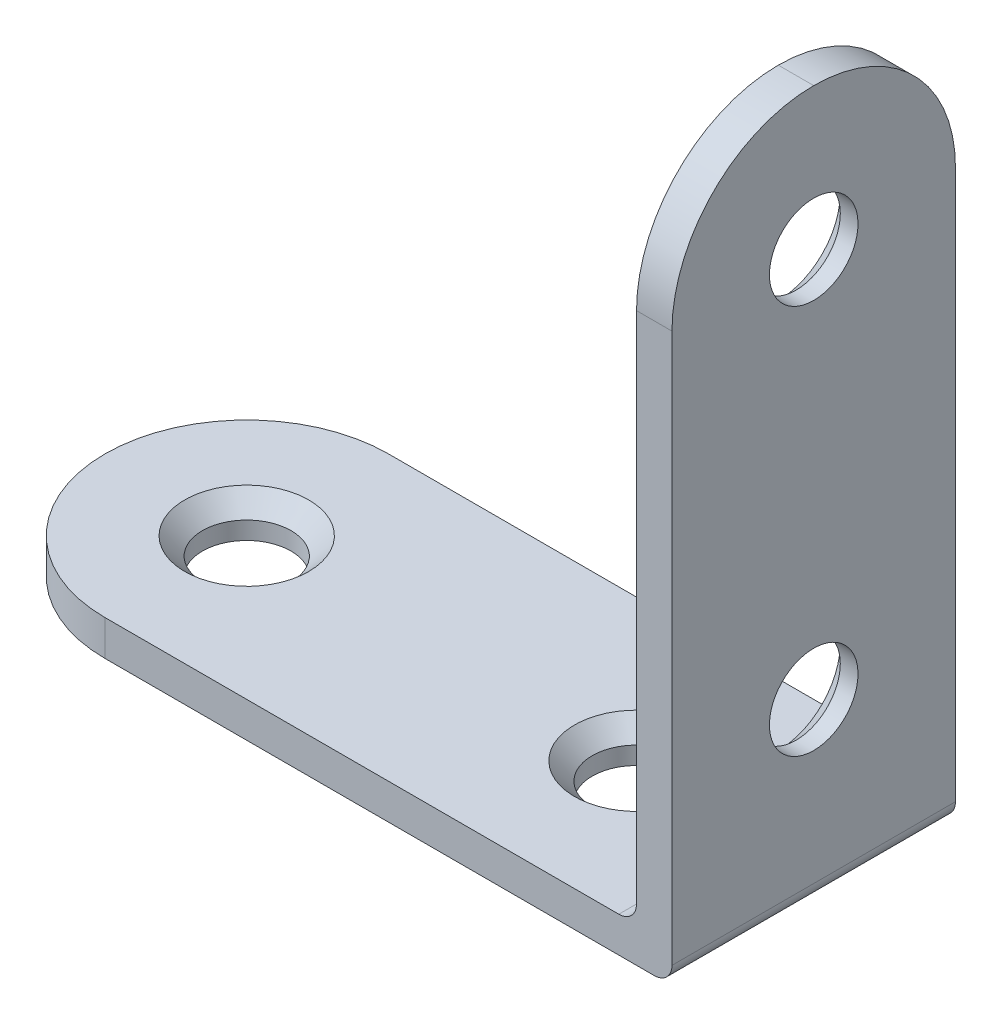
ISO-10303-21;
HEADER;
FILE_DESCRIPTION(('STEP AP214'),'2;1');
FILE_NAME('part.step','',(''),(''),'','','');
FILE_SCHEMA(('AUTOMOTIVE_DESIGN { 1 0 10303 214 1 1 1 1 }'));
ENDSEC;
DATA;
#1=APPLICATION_CONTEXT('core data for automotive mechanical design processes');
#2=APPLICATION_PROTOCOL_DEFINITION('international standard','automotive_design',2000,#1);
#3=PRODUCT_CONTEXT('',#1,'mechanical');
#4=PRODUCT('Part','Part','',(#3));
#5=PRODUCT_RELATED_PRODUCT_CATEGORY('part','',(#4));
#6=PRODUCT_DEFINITION_FORMATION('','',#4);
#7=PRODUCT_DEFINITION_CONTEXT('part definition',#1,'design');
#8=PRODUCT_DEFINITION('design','',#6,#7);
#9=PRODUCT_DEFINITION_SHAPE('','',#8);
#10=(LENGTH_UNIT() NAMED_UNIT(*) SI_UNIT(.MILLI.,.METRE.));
#11=(NAMED_UNIT(*) PLANE_ANGLE_UNIT() SI_UNIT($,.RADIAN.));
#12=(NAMED_UNIT(*) SI_UNIT($,.STERADIAN.) SOLID_ANGLE_UNIT());
#13=UNCERTAINTY_MEASURE_WITH_UNIT(LENGTH_MEASURE(1.E-05),#10,'distance_accuracy_value','');
#14=(GEOMETRIC_REPRESENTATION_CONTEXT(3) GLOBAL_UNCERTAINTY_ASSIGNED_CONTEXT((#13)) GLOBAL_UNIT_ASSIGNED_CONTEXT((#10,
#11,#12)) REPRESENTATION_CONTEXT('',''));
#15=CARTESIAN_POINT('',(0.,0.,0.));
#16=DIRECTION('',(0.,0.,1.));
#17=DIRECTION('',(1.,0.,0.));
#18=AXIS2_PLACEMENT_3D('',#15,#16,#17);
#19=CARTESIAN_POINT('',(0.,38.,16.));
#20=DIRECTION('',(1.,0.,0.));
#21=DIRECTION('',(0.,1.,0.));
#22=AXIS2_PLACEMENT_3D('',#19,#20,#21);
#23=PLANE('',#22);
#24=CARTESIAN_POINT('',(0.,8.00000000000003,8.));
#25=DIRECTION('',(1.,0.,0.));
#26=DIRECTION('',(0.,1.,0.));
#27=AXIS2_PLACEMENT_3D('',#24,#25,#26);
#28=CIRCLE('',#27,3.5);
#29=CARTESIAN_POINT('',(0.,11.5,8.));
#30=VERTEX_POINT('',#29);
#31=EDGE_CURVE('E210',#30,#30,#28,.T.);
#32=ORIENTED_EDGE('',*,*,#31,.T.);
#33=EDGE_LOOP('',(#32));
#34=FACE_BOUND('',#33,.T.);
#35=CARTESIAN_POINT('',(0.,30.,8.));
#36=DIRECTION('',(1.,0.,0.));
#37=DIRECTION('',(0.,1.,0.));
#38=AXIS2_PLACEMENT_3D('',#35,#36,#37);
#39=CIRCLE('',#38,3.5);
#40=CARTESIAN_POINT('',(0.,33.5,8.));
#41=VERTEX_POINT('',#40);
#42=EDGE_CURVE('E206',#41,#41,#39,.T.);
#43=ORIENTED_EDGE('',*,*,#42,.T.);
#44=EDGE_LOOP('',(#43));
#45=FACE_BOUND('',#44,.T.);
#46=DIRECTION('',(0.,-1.,0.));
#47=VECTOR('',#46,1.);
#48=CARTESIAN_POINT('',(0.,38.,0.));
#49=LINE('',#48,#47);
#50=CARTESIAN_POINT('',(0.,30.,0.));
#51=VERTEX_POINT('',#50);
#52=CARTESIAN_POINT('',(0.,1.,0.));
#53=VERTEX_POINT('',#52);
#54=EDGE_CURVE('E182',#51,#53,#49,.T.);
#55=ORIENTED_EDGE('',*,*,#54,.T.);
#56=DIRECTION('',(0.,0.,-1.));
#57=VECTOR('',#56,1.);
#58=CARTESIAN_POINT('',(0.,1.,16.));
#59=LINE('',#58,#57);
#60=CARTESIAN_POINT('',(0.,1.,16.));
#61=VERTEX_POINT('',#60);
#62=EDGE_CURVE('E55',#53,#61,#59,.F.);
#63=ORIENTED_EDGE('',*,*,#62,.T.);
#64=DIRECTION('',(0.,-1.,0.));
#65=VECTOR('',#64,1.);
#66=CARTESIAN_POINT('',(0.,38.,16.));
#67=LINE('',#66,#65);
#68=CARTESIAN_POINT('',(0.,30.,16.));
#69=VERTEX_POINT('',#68);
#70=EDGE_CURVE('E266',#69,#61,#67,.T.);
#71=ORIENTED_EDGE('',*,*,#70,.F.);
#72=CARTESIAN_POINT('',(0.,30.,8.));
#73=DIRECTION('',(1.,0.,0.));
#74=DIRECTION('',(0.,1.,0.));
#75=AXIS2_PLACEMENT_3D('',#72,#73,#74);
#76=CIRCLE('',#75,8.);
#77=CARTESIAN_POINT('',(0.,38.,8.));
#78=VERTEX_POINT('',#77);
#79=EDGE_CURVE('E168',#69,#78,#76,.F.);
#80=ORIENTED_EDGE('',*,*,#79,.T.);
#81=CARTESIAN_POINT('',(0.,30.,8.));
#82=DIRECTION('',(1.,0.,0.));
#83=DIRECTION('',(0.,1.,0.));
#84=AXIS2_PLACEMENT_3D('',#81,#82,#83);
#85=CIRCLE('',#84,8.);
#86=EDGE_CURVE('E165',#78,#51,#85,.F.);
#87=ORIENTED_EDGE('',*,*,#86,.T.);
#88=EDGE_LOOP('',(#55,#63,#71,#80,#87));
#89=FACE_BOUND('',#88,.T.);
#90=ADVANCED_FACE('F39',(#34,#45,#89),#23,.F.);
#91=CARTESIAN_POINT('',(0.,0.,16.));
#92=DIRECTION('',(0.,-1.,0.));
#93=DIRECTION('',(1.,0.,0.));
#94=AXIS2_PLACEMENT_3D('',#91,#92,#93);
#95=PLANE('',#94);
#96=CARTESIAN_POINT('',(-8.00000000000001,0.,8.));
#97=DIRECTION('',(0.,-1.,0.));
#98=DIRECTION('',(1.,0.,0.));
#99=AXIS2_PLACEMENT_3D('',#96,#97,#98);
#100=CIRCLE('',#99,3.50000000000001);
#101=CARTESIAN_POINT('',(-4.5,0.,8.));
#102=VERTEX_POINT('',#101);
#103=EDGE_CURVE('E222',#102,#102,#100,.T.);
#104=ORIENTED_EDGE('',*,*,#103,.T.);
#105=EDGE_LOOP('',(#104));
#106=FACE_BOUND('',#105,.T.);
#107=CARTESIAN_POINT('',(-30.,0.,8.));
#108=DIRECTION('',(0.,-1.,0.));
#109=DIRECTION('',(1.,0.,0.));
#110=AXIS2_PLACEMENT_3D('',#107,#108,#109);
#111=CIRCLE('',#110,3.50000000000003);
#112=CARTESIAN_POINT('',(-26.5,0.,8.));
#113=VERTEX_POINT('',#112);
#114=EDGE_CURVE('E218',#113,#113,#111,.T.);
#115=ORIENTED_EDGE('',*,*,#114,.T.);
#116=EDGE_LOOP('',(#115));
#117=FACE_BOUND('',#116,.T.);
#118=DIRECTION('',(-1.,0.,0.));
#119=VECTOR('',#118,1.);
#120=CARTESIAN_POINT('',(0.,0.,16.));
#121=LINE('',#120,#119);
#122=CARTESIAN_POINT('',(-1.,0.,16.));
#123=VERTEX_POINT('',#122);
#124=CARTESIAN_POINT('',(-30.,0.,16.));
#125=VERTEX_POINT('',#124);
#126=EDGE_CURVE('E261',#123,#125,#121,.T.);
#127=ORIENTED_EDGE('',*,*,#126,.F.);
#128=DIRECTION('',(0.,0.,-1.));
#129=VECTOR('',#128,1.);
#130=CARTESIAN_POINT('',(-1.,0.,0.));
#131=LINE('',#130,#129);
#132=CARTESIAN_POINT('',(-1.,0.,0.));
#133=VERTEX_POINT('',#132);
#134=EDGE_CURVE('E246',#123,#133,#131,.T.);
#135=ORIENTED_EDGE('',*,*,#134,.T.);
#136=DIRECTION('',(-1.,0.,0.));
#137=VECTOR('',#136,1.);
#138=CARTESIAN_POINT('',(0.,0.,0.));
#139=LINE('',#138,#137);
#140=CARTESIAN_POINT('',(-30.,0.,0.));
#141=VERTEX_POINT('',#140);
#142=EDGE_CURVE('E141',#133,#141,#139,.T.);
#143=ORIENTED_EDGE('',*,*,#142,.T.);
#144=CARTESIAN_POINT('',(-30.,0.,8.));
#145=DIRECTION('',(0.,-1.,0.));
#146=DIRECTION('',(1.,0.,0.));
#147=AXIS2_PLACEMENT_3D('',#144,#145,#146);
#148=CIRCLE('',#147,8.);
#149=CARTESIAN_POINT('',(-38.,0.,8.));
#150=VERTEX_POINT('',#149);
#151=EDGE_CURVE('E145',#141,#150,#148,.F.);
#152=ORIENTED_EDGE('',*,*,#151,.T.);
#153=CARTESIAN_POINT('',(-30.,0.,8.));
#154=DIRECTION('',(0.,-1.,0.));
#155=DIRECTION('',(1.,0.,0.));
#156=AXIS2_PLACEMENT_3D('',#153,#154,#155);
#157=CIRCLE('',#156,8.);
#158=EDGE_CURVE('E147',#150,#125,#157,.F.);
#159=ORIENTED_EDGE('',*,*,#158,.T.);
#160=EDGE_LOOP('',(#127,#135,#143,#152,#159));
#161=FACE_BOUND('',#160,.T.);
#162=ADVANCED_FACE('F260',(#106,#117,#161),#95,.F.);
#163=CARTESIAN_POINT('',(-38.,-2.,16.));
#164=DIRECTION('',(0.,1.,0.));
#165=DIRECTION('',(-1.,0.,0.));
#166=AXIS2_PLACEMENT_3D('',#163,#164,#165);
#167=PLANE('',#166);
#168=CARTESIAN_POINT('',(-30.,-1.99999999999999,8.));
#169=DIRECTION('',(0.,1.,0.));
#170=DIRECTION('',(-1.,0.,0.));
#171=AXIS2_PLACEMENT_3D('',#168,#169,#170);
#172=CIRCLE('',#171,2.5);
#173=CARTESIAN_POINT('',(-32.5,-1.99999999999999,8.));
#174=VERTEX_POINT('',#173);
#175=EDGE_CURVE('E192',#174,#174,#172,.T.);
#176=ORIENTED_EDGE('',*,*,#175,.T.);
#177=EDGE_LOOP('',(#176));
#178=FACE_BOUND('',#177,.T.);
#179=CARTESIAN_POINT('',(-8.00000000000001,-2.,8.));
#180=DIRECTION('',(0.,1.,0.));
#181=DIRECTION('',(-1.,0.,0.));
#182=AXIS2_PLACEMENT_3D('',#179,#180,#181);
#183=CIRCLE('',#182,2.5);
#184=CARTESIAN_POINT('',(-10.5,-2.,8.));
#185=VERTEX_POINT('',#184);
#186=EDGE_CURVE('E196',#185,#185,#183,.T.);
#187=ORIENTED_EDGE('',*,*,#186,.T.);
#188=EDGE_LOOP('',(#187));
#189=FACE_BOUND('',#188,.T.);
#190=DIRECTION('',(1.,0.,0.));
#191=VECTOR('',#190,1.);
#192=CARTESIAN_POINT('',(-38.,-2.,0.));
#193=LINE('',#192,#191);
#194=CARTESIAN_POINT('',(-30.,-2.,0.));
#195=VERTEX_POINT('',#194);
#196=CARTESIAN_POINT('',(1.,-2.,0.));
#197=VERTEX_POINT('',#196);
#198=EDGE_CURVE('E120',#195,#197,#193,.T.);
#199=ORIENTED_EDGE('',*,*,#198,.T.);
#200=DIRECTION('',(0.,0.,-1.));
#201=VECTOR('',#200,1.);
#202=CARTESIAN_POINT('',(1.,-2.,16.));
#203=LINE('',#202,#201);
#204=CARTESIAN_POINT('',(1.,-2.,16.));
#205=VERTEX_POINT('',#204);
#206=EDGE_CURVE('E240',#197,#205,#203,.F.);
#207=ORIENTED_EDGE('',*,*,#206,.T.);
#208=DIRECTION('',(1.,0.,0.));
#209=VECTOR('',#208,1.);
#210=CARTESIAN_POINT('',(-38.,-2.,16.));
#211=LINE('',#210,#209);
#212=CARTESIAN_POINT('',(-30.,-2.,16.));
#213=VERTEX_POINT('',#212);
#214=EDGE_CURVE('E265',#213,#205,#211,.T.);
#215=ORIENTED_EDGE('',*,*,#214,.F.);
#216=CARTESIAN_POINT('',(-30.,-2.,8.));
#217=DIRECTION('',(0.,1.,0.));
#218=DIRECTION('',(-1.,0.,0.));
#219=AXIS2_PLACEMENT_3D('',#216,#217,#218);
#220=CIRCLE('',#219,8.);
#221=CARTESIAN_POINT('',(-38.,-2.,8.));
#222=VERTEX_POINT('',#221);
#223=EDGE_CURVE('E124',#213,#222,#220,.F.);
#224=ORIENTED_EDGE('',*,*,#223,.T.);
#225=CARTESIAN_POINT('',(-30.,-2.,8.));
#226=DIRECTION('',(0.,1.,0.));
#227=DIRECTION('',(-1.,0.,0.));
#228=AXIS2_PLACEMENT_3D('',#225,#226,#227);
#229=CIRCLE('',#228,8.);
#230=EDGE_CURVE('E117',#222,#195,#229,.F.);
#231=ORIENTED_EDGE('',*,*,#230,.T.);
#232=EDGE_LOOP('',(#199,#207,#215,#224,#231));
#233=FACE_BOUND('',#232,.T.);
#234=ADVANCED_FACE('F119',(#178,#189,#233),#167,.F.);
#235=CARTESIAN_POINT('',(2.,-2.,16.));
#236=DIRECTION('',(-1.,0.,0.));
#237=DIRECTION('',(0.,-1.,0.));
#238=AXIS2_PLACEMENT_3D('',#235,#236,#237);
#239=PLANE('',#238);
#240=CARTESIAN_POINT('',(2.,30.,8.));
#241=DIRECTION('',(-1.,0.,0.));
#242=DIRECTION('',(0.,-1.,0.));
#243=AXIS2_PLACEMENT_3D('',#240,#241,#242);
#244=CIRCLE('',#243,2.5);
#245=CARTESIAN_POINT('',(2.,27.5,8.));
#246=VERTEX_POINT('',#245);
#247=EDGE_CURVE('E187',#246,#246,#244,.T.);
#248=ORIENTED_EDGE('',*,*,#247,.T.);
#249=EDGE_LOOP('',(#248));
#250=FACE_BOUND('',#249,.T.);
#251=CARTESIAN_POINT('',(2.,8.00000000000003,8.));
#252=DIRECTION('',(-1.,0.,0.));
#253=DIRECTION('',(0.,-1.,0.));
#254=AXIS2_PLACEMENT_3D('',#251,#252,#253);
#255=CIRCLE('',#254,2.5);
#256=CARTESIAN_POINT('',(2.,5.50000000000003,8.));
#257=VERTEX_POINT('',#256);
#258=EDGE_CURVE('E188',#257,#257,#255,.T.);
#259=ORIENTED_EDGE('',*,*,#258,.T.);
#260=EDGE_LOOP('',(#259));
#261=FACE_BOUND('',#260,.T.);
#262=DIRECTION('',(0.,1.,0.));
#263=VECTOR('',#262,1.);
#264=CARTESIAN_POINT('',(2.,-2.,16.));
#265=LINE('',#264,#263);
#266=CARTESIAN_POINT('',(2.,-1.,16.));
#267=VERTEX_POINT('',#266);
#268=CARTESIAN_POINT('',(2.,30.,16.));
#269=VERTEX_POINT('',#268);
#270=EDGE_CURVE('E271',#267,#269,#265,.T.);
#271=ORIENTED_EDGE('',*,*,#270,.F.);
#272=DIRECTION('',(0.,0.,-1.));
#273=VECTOR('',#272,1.);
#274=CARTESIAN_POINT('',(2.,-1.,16.));
#275=LINE('',#274,#273);
#276=CARTESIAN_POINT('',(2.,-1.,0.));
#277=VERTEX_POINT('',#276);
#278=EDGE_CURVE('E234',#267,#277,#275,.T.);
#279=ORIENTED_EDGE('',*,*,#278,.T.);
#280=DIRECTION('',(0.,1.,0.));
#281=VECTOR('',#280,1.);
#282=CARTESIAN_POINT('',(2.,-2.,0.));
#283=LINE('',#282,#281);
#284=CARTESIAN_POINT('',(2.,30.,0.));
#285=VERTEX_POINT('',#284);
#286=EDGE_CURVE('E140',#277,#285,#283,.T.);
#287=ORIENTED_EDGE('',*,*,#286,.T.);
#288=CARTESIAN_POINT('',(2.,30.,8.));
#289=DIRECTION('',(-1.,0.,0.));
#290=DIRECTION('',(0.,-1.,0.));
#291=AXIS2_PLACEMENT_3D('',#288,#289,#290);
#292=CIRCLE('',#291,8.);
#293=CARTESIAN_POINT('',(2.,38.,8.));
#294=VERTEX_POINT('',#293);
#295=EDGE_CURVE('E171',#285,#294,#292,.F.);
#296=ORIENTED_EDGE('',*,*,#295,.T.);
#297=CARTESIAN_POINT('',(2.,30.,8.));
#298=DIRECTION('',(-1.,0.,0.));
#299=DIRECTION('',(0.,-1.,0.));
#300=AXIS2_PLACEMENT_3D('',#297,#298,#299);
#301=CIRCLE('',#300,8.);
#302=EDGE_CURVE('E174',#294,#269,#301,.F.);
#303=ORIENTED_EDGE('',*,*,#302,.T.);
#304=EDGE_LOOP('',(#271,#279,#287,#296,#303));
#305=FACE_BOUND('',#304,.T.);
#306=ADVANCED_FACE('F284',(#250,#261,#305),#239,.F.);
#307=CARTESIAN_POINT('',(0.,0.,16.));
#308=DIRECTION('',(0.,0.,1.));
#309=DIRECTION('',(1.,0.,0.));
#310=AXIS2_PLACEMENT_3D('',#307,#308,#309);
#311=PLANE('',#310);
#312=ORIENTED_EDGE('',*,*,#214,.T.);
#313=CARTESIAN_POINT('',(0.999999999999998,-1.,16.));
#314=DIRECTION('',(0.,0.,1.));
#315=DIRECTION('',(1.,0.,0.));
#316=AXIS2_PLACEMENT_3D('',#313,#314,#315);
#317=CIRCLE('',#316,1.);
#318=EDGE_CURVE('E243',#205,#267,#317,.T.);
#319=ORIENTED_EDGE('',*,*,#318,.T.);
#320=ORIENTED_EDGE('',*,*,#270,.T.);
#321=DIRECTION('',(-1.,0.,0.));
#322=VECTOR('',#321,1.);
#323=CARTESIAN_POINT('',(0.,30.,16.));
#324=LINE('',#323,#322);
#325=EDGE_CURVE('E158',#269,#69,#324,.T.);
#326=ORIENTED_EDGE('',*,*,#325,.T.);
#327=ORIENTED_EDGE('',*,*,#70,.T.);
#328=CARTESIAN_POINT('',(-1.,1.,16.));
#329=DIRECTION('',(0.,0.,1.));
#330=DIRECTION('',(1.,0.,0.));
#331=AXIS2_PLACEMENT_3D('',#328,#329,#330);
#332=CIRCLE('',#331,1.);
#333=EDGE_CURVE('E11',#61,#123,#332,.F.);
#334=ORIENTED_EDGE('',*,*,#333,.T.);
#335=ORIENTED_EDGE('',*,*,#126,.T.);
#336=DIRECTION('',(0.,-1.,0.));
#337=VECTOR('',#336,1.);
#338=CARTESIAN_POINT('',(-30.,-2.,16.));
#339=LINE('',#338,#337);
#340=EDGE_CURVE('E162',#125,#213,#339,.T.);
#341=ORIENTED_EDGE('',*,*,#340,.T.);
#342=EDGE_LOOP('',(#312,#319,#320,#326,#327,#334,#335,#341));
#343=FACE_BOUND('',#342,.T.);
#344=ADVANCED_FACE('F297',(#343),#311,.T.);
#345=CARTESIAN_POINT('',(0.,0.,0.));
#346=DIRECTION('',(0.,0.,1.));
#347=DIRECTION('',(1.,0.,0.));
#348=AXIS2_PLACEMENT_3D('',#345,#346,#347);
#349=PLANE('',#348);
#350=ORIENTED_EDGE('',*,*,#286,.F.);
#351=CARTESIAN_POINT('',(0.999999999999998,-1.,0.));
#352=DIRECTION('',(0.,0.,1.));
#353=DIRECTION('',(1.,0.,0.));
#354=AXIS2_PLACEMENT_3D('',#351,#352,#353);
#355=CIRCLE('',#354,1.);
#356=EDGE_CURVE('E138',#277,#197,#355,.F.);
#357=ORIENTED_EDGE('',*,*,#356,.T.);
#358=ORIENTED_EDGE('',*,*,#198,.F.);
#359=DIRECTION('',(0.,-1.,0.));
#360=VECTOR('',#359,1.);
#361=CARTESIAN_POINT('',(-30.,0.,0.));
#362=LINE('',#361,#360);
#363=EDGE_CURVE('E137',#195,#141,#362,.F.);
#364=ORIENTED_EDGE('',*,*,#363,.T.);
#365=ORIENTED_EDGE('',*,*,#142,.F.);
#366=CARTESIAN_POINT('',(-1.,1.,0.));
#367=DIRECTION('',(0.,0.,1.));
#368=DIRECTION('',(1.,0.,0.));
#369=AXIS2_PLACEMENT_3D('',#366,#367,#368);
#370=CIRCLE('',#369,1.);
#371=EDGE_CURVE('E48',#133,#53,#370,.T.);
#372=ORIENTED_EDGE('',*,*,#371,.T.);
#373=ORIENTED_EDGE('',*,*,#54,.F.);
#374=DIRECTION('',(-1.,0.,0.));
#375=VECTOR('',#374,1.);
#376=CARTESIAN_POINT('',(0.,30.,0.));
#377=LINE('',#376,#375);
#378=EDGE_CURVE('E130',#51,#285,#377,.F.);
#379=ORIENTED_EDGE('',*,*,#378,.T.);
#380=EDGE_LOOP('',(#350,#357,#358,#364,#365,#372,#373,#379));
#381=FACE_BOUND('',#380,.T.);
#382=ADVANCED_FACE('F135',(#381),#349,.F.);
#383=CARTESIAN_POINT('',(-30.,0.,8.));
#384=DIRECTION('',(0.,1.,0.));
#385=DIRECTION('',(0.,0.,1.));
#386=AXIS2_PLACEMENT_3D('',#383,#384,#385);
#387=CYLINDRICAL_SURFACE('',#386,8.);
#388=ORIENTED_EDGE('',*,*,#340,.F.);
#389=ORIENTED_EDGE('',*,*,#158,.F.);
#390=DIRECTION('',(0.,-1.,0.));
#391=VECTOR('',#390,1.);
#392=CARTESIAN_POINT('',(-38.,0.,8.));
#393=LINE('',#392,#391);
#394=EDGE_CURVE('E179',#222,#150,#393,.F.);
#395=ORIENTED_EDGE('',*,*,#394,.F.);
#396=ORIENTED_EDGE('',*,*,#223,.F.);
#397=EDGE_LOOP('',(#388,#389,#395,#396));
#398=FACE_BOUND('',#397,.T.);
#399=ADVANCED_FACE('F299',(#398),#387,.T.);
#400=CARTESIAN_POINT('',(-30.,0.,8.));
#401=DIRECTION('',(0.,-1.,0.));
#402=DIRECTION('',(0.,0.,-1.));
#403=AXIS2_PLACEMENT_3D('',#400,#401,#402);
#404=CYLINDRICAL_SURFACE('',#403,8.);
#405=ORIENTED_EDGE('',*,*,#151,.F.);
#406=ORIENTED_EDGE('',*,*,#363,.F.);
#407=ORIENTED_EDGE('',*,*,#230,.F.);
#408=ORIENTED_EDGE('',*,*,#394,.T.);
#409=EDGE_LOOP('',(#405,#406,#407,#408));
#410=FACE_BOUND('',#409,.T.);
#411=ADVANCED_FACE('F144',(#410),#404,.T.);
#412=CARTESIAN_POINT('',(2.,30.,8.));
#413=DIRECTION('',(-1.,0.,0.));
#414=DIRECTION('',(0.,0.,1.));
#415=AXIS2_PLACEMENT_3D('',#412,#413,#414);
#416=CYLINDRICAL_SURFACE('',#415,8.);
#417=DIRECTION('',(-1.,0.,0.));
#418=VECTOR('',#417,1.);
#419=CARTESIAN_POINT('',(2.,38.,8.));
#420=LINE('',#419,#418);
#421=EDGE_CURVE('E183',#294,#78,#420,.T.);
#422=ORIENTED_EDGE('',*,*,#421,.F.);
#423=ORIENTED_EDGE('',*,*,#295,.F.);
#424=ORIENTED_EDGE('',*,*,#378,.F.);
#425=ORIENTED_EDGE('',*,*,#86,.F.);
#426=EDGE_LOOP('',(#422,#423,#424,#425));
#427=FACE_BOUND('',#426,.T.);
#428=ADVANCED_FACE('F289',(#427),#416,.T.);
#429=CARTESIAN_POINT('',(0.,30.,8.));
#430=DIRECTION('',(1.,0.,0.));
#431=DIRECTION('',(0.,0.,-1.));
#432=AXIS2_PLACEMENT_3D('',#429,#430,#431);
#433=CYLINDRICAL_SURFACE('',#432,8.);
#434=ORIENTED_EDGE('',*,*,#302,.F.);
#435=ORIENTED_EDGE('',*,*,#421,.T.);
#436=ORIENTED_EDGE('',*,*,#79,.F.);
#437=ORIENTED_EDGE('',*,*,#325,.F.);
#438=EDGE_LOOP('',(#434,#435,#436,#437));
#439=FACE_BOUND('',#438,.T.);
#440=ADVANCED_FACE('F293',(#439),#433,.T.);
#441=CARTESIAN_POINT('',(16.,8.00000000000003,8.));
#442=DIRECTION('',(-1.,0.,0.));
#443=DIRECTION('',(0.,-1.,0.));
#444=AXIS2_PLACEMENT_3D('',#441,#442,#443);
#445=CYLINDRICAL_SURFACE('',#444,2.5);
#446=CARTESIAN_POINT('',(0.999999999999997,8.00000000000003,8.));
#447=DIRECTION('',(1.,0.,0.));
#448=DIRECTION('',(0.,0.,-1.));
#449=AXIS2_PLACEMENT_3D('',#446,#447,#448);
#450=CIRCLE('',#449,2.5);
#451=CARTESIAN_POINT('',(0.999999999999997,8.00000000000003,5.5));
#452=VERTEX_POINT('',#451);
#453=EDGE_CURVE('E178',#452,#452,#450,.F.);
#454=ORIENTED_EDGE('',*,*,#453,.T.);
#455=EDGE_LOOP('',(#454));
#456=FACE_BOUND('',#455,.T.);
#457=ORIENTED_EDGE('',*,*,#258,.F.);
#458=EDGE_LOOP('',(#457));
#459=FACE_BOUND('',#458,.T.);
#460=ADVANCED_FACE('F327',(#456,#459),#445,.F.);
#461=CARTESIAN_POINT('',(16.,30.,8.));
#462=DIRECTION('',(-1.,0.,0.));
#463=DIRECTION('',(0.,-1.,0.));
#464=AXIS2_PLACEMENT_3D('',#461,#462,#463);
#465=CYLINDRICAL_SURFACE('',#464,2.5);
#466=CARTESIAN_POINT('',(0.999999999999997,30.,8.));
#467=DIRECTION('',(1.,0.,0.));
#468=DIRECTION('',(0.,0.,-1.));
#469=AXIS2_PLACEMENT_3D('',#466,#467,#468);
#470=CIRCLE('',#469,2.5);
#471=CARTESIAN_POINT('',(0.999999999999997,30.,5.5));
#472=VERTEX_POINT('',#471);
#473=EDGE_CURVE('E230',#472,#472,#470,.F.);
#474=ORIENTED_EDGE('',*,*,#473,.T.);
#475=EDGE_LOOP('',(#474));
#476=FACE_BOUND('',#475,.T.);
#477=ORIENTED_EDGE('',*,*,#247,.F.);
#478=EDGE_LOOP('',(#477));
#479=FACE_BOUND('',#478,.T.);
#480=ADVANCED_FACE('F330',(#476,#479),#465,.F.);
#481=CARTESIAN_POINT('',(-8.00000000000001,-16.,8.));
#482=DIRECTION('',(0.,1.,0.));
#483=DIRECTION('',(-1.,0.,0.));
#484=AXIS2_PLACEMENT_3D('',#481,#482,#483);
#485=CYLINDRICAL_SURFACE('',#484,2.5);
#486=CARTESIAN_POINT('',(-8.00000000000001,-1.,8.));
#487=DIRECTION('',(0.,-1.,0.));
#488=DIRECTION('',(0.,0.,-1.));
#489=AXIS2_PLACEMENT_3D('',#486,#487,#488);
#490=CIRCLE('',#489,2.5);
#491=CARTESIAN_POINT('',(-8.00000000000001,-1.,5.5));
#492=VERTEX_POINT('',#491);
#493=EDGE_CURVE('E214',#492,#492,#490,.F.);
#494=ORIENTED_EDGE('',*,*,#493,.T.);
#495=EDGE_LOOP('',(#494));
#496=FACE_BOUND('',#495,.T.);
#497=ORIENTED_EDGE('',*,*,#186,.F.);
#498=EDGE_LOOP('',(#497));
#499=FACE_BOUND('',#498,.T.);
#500=ADVANCED_FACE('F334',(#496,#499),#485,.F.);
#501=CARTESIAN_POINT('',(-30.,-16.,8.));
#502=DIRECTION('',(0.,1.,0.));
#503=DIRECTION('',(-1.,0.,0.));
#504=AXIS2_PLACEMENT_3D('',#501,#502,#503);
#505=CYLINDRICAL_SURFACE('',#504,2.5);
#506=CARTESIAN_POINT('',(-30.,-1.00000000000002,8.));
#507=DIRECTION('',(0.,-1.,0.));
#508=DIRECTION('',(1.,0.,0.));
#509=AXIS2_PLACEMENT_3D('',#506,#507,#508);
#510=CIRCLE('',#509,2.5);
#511=CARTESIAN_POINT('',(-27.5,-1.00000000000001,8.));
#512=VERTEX_POINT('',#511);
#513=EDGE_CURVE('E226',#512,#512,#510,.F.);
#514=ORIENTED_EDGE('',*,*,#513,.T.);
#515=EDGE_LOOP('',(#514));
#516=FACE_BOUND('',#515,.T.);
#517=ORIENTED_EDGE('',*,*,#175,.F.);
#518=EDGE_LOOP('',(#517));
#519=FACE_BOUND('',#518,.T.);
#520=ADVANCED_FACE('F338',(#516,#519),#505,.F.);
#521=CARTESIAN_POINT('',(0.999999999999997,8.00000000000003,8.));
#522=DIRECTION('',(-1.,0.,0.));
#523=DIRECTION('',(0.,0.,1.));
#524=AXIS2_PLACEMENT_3D('',#521,#522,#523);
#525=CONICAL_SURFACE('',#524,2.5,0.785398163397448);
#526=ORIENTED_EDGE('',*,*,#31,.F.);
#527=EDGE_LOOP('',(#526));
#528=FACE_BOUND('',#527,.T.);
#529=ORIENTED_EDGE('',*,*,#453,.F.);
#530=EDGE_LOOP('',(#529));
#531=FACE_BOUND('',#530,.T.);
#532=ADVANCED_FACE('F341',(#528,#531),#525,.F.);
#533=CARTESIAN_POINT('',(-8.00000000000001,-1.,8.));
#534=DIRECTION('',(0.,1.,0.));
#535=DIRECTION('',(0.,0.,1.));
#536=AXIS2_PLACEMENT_3D('',#533,#534,#535);
#537=CONICAL_SURFACE('',#536,2.5,0.785398163397451);
#538=ORIENTED_EDGE('',*,*,#103,.F.);
#539=EDGE_LOOP('',(#538));
#540=FACE_BOUND('',#539,.T.);
#541=ORIENTED_EDGE('',*,*,#493,.F.);
#542=EDGE_LOOP('',(#541));
#543=FACE_BOUND('',#542,.T.);
#544=ADVANCED_FACE('F346',(#540,#543),#537,.F.);
#545=CARTESIAN_POINT('',(-30.,-1.00000000000002,8.));
#546=DIRECTION('',(0.,1.,0.));
#547=DIRECTION('',(-1.,0.,0.));
#548=AXIS2_PLACEMENT_3D('',#545,#546,#547);
#549=CONICAL_SURFACE('',#548,2.5,0.785398163397447);
#550=ORIENTED_EDGE('',*,*,#114,.F.);
#551=EDGE_LOOP('',(#550));
#552=FACE_BOUND('',#551,.T.);
#553=ORIENTED_EDGE('',*,*,#513,.F.);
#554=EDGE_LOOP('',(#553));
#555=FACE_BOUND('',#554,.T.);
#556=ADVANCED_FACE('F356',(#552,#555),#549,.F.);
#557=CARTESIAN_POINT('',(0.999999999999997,30.,8.));
#558=DIRECTION('',(-1.,0.,0.));
#559=DIRECTION('',(0.,0.,1.));
#560=AXIS2_PLACEMENT_3D('',#557,#558,#559);
#561=CONICAL_SURFACE('',#560,2.5,0.785398163397448);
#562=ORIENTED_EDGE('',*,*,#42,.F.);
#563=EDGE_LOOP('',(#562));
#564=FACE_BOUND('',#563,.T.);
#565=ORIENTED_EDGE('',*,*,#473,.F.);
#566=EDGE_LOOP('',(#565));
#567=FACE_BOUND('',#566,.T.);
#568=ADVANCED_FACE('F358',(#564,#567),#561,.F.);
#569=CARTESIAN_POINT('',(0.999999999999998,-1.,16.));
#570=DIRECTION('',(0.,0.,-1.));
#571=DIRECTION('',(-1.,0.,0.));
#572=AXIS2_PLACEMENT_3D('',#569,#570,#571);
#573=CYLINDRICAL_SURFACE('',#572,1.);
#574=ORIENTED_EDGE('',*,*,#318,.F.);
#575=ORIENTED_EDGE('',*,*,#206,.F.);
#576=ORIENTED_EDGE('',*,*,#356,.F.);
#577=ORIENTED_EDGE('',*,*,#278,.F.);
#578=EDGE_LOOP('',(#574,#575,#576,#577));
#579=FACE_BOUND('',#578,.T.);
#580=ADVANCED_FACE('F296',(#579),#573,.T.);
#581=CARTESIAN_POINT('',(-1.,1.,16.));
#582=DIRECTION('',(0.,0.,1.));
#583=DIRECTION('',(1.,0.,0.));
#584=AXIS2_PLACEMENT_3D('',#581,#582,#583);
#585=CYLINDRICAL_SURFACE('',#584,1.);
#586=ORIENTED_EDGE('',*,*,#333,.F.);
#587=ORIENTED_EDGE('',*,*,#62,.F.);
#588=ORIENTED_EDGE('',*,*,#371,.F.);
#589=ORIENTED_EDGE('',*,*,#134,.F.);
#590=EDGE_LOOP('',(#586,#587,#588,#589));
#591=FACE_BOUND('',#590,.T.);
#592=ADVANCED_FACE('F41',(#591),#585,.F.);
#593=CLOSED_SHELL('',(#90,#162,#234,#306,#344,#382,#399,#411,#428,#440,#460,#480,#500,#520,#532,
#544,#556,#568,#580,#592));
#594=MANIFOLD_SOLID_BREP('B2',#593);
#595=ADVANCED_BREP_SHAPE_REPRESENTATION('',(#18,#594),#14);
#596=SHAPE_DEFINITION_REPRESENTATION(#9,#595);
ENDSEC;
END-ISO-10303-21;
